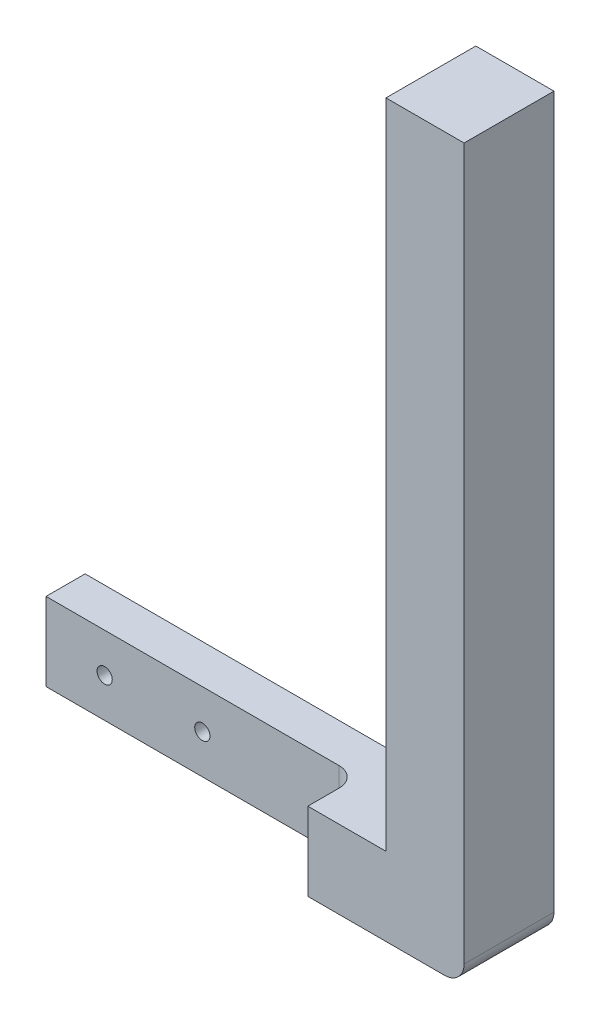
ISO-10303-21;
HEADER;
FILE_DESCRIPTION(('STEP AP214'),'2;1');
FILE_NAME('part.step','',(''),(''),'','','');
FILE_SCHEMA(('AUTOMOTIVE_DESIGN { 1 0 10303 214 1 1 1 1 }'));
ENDSEC;
DATA;
#1=APPLICATION_CONTEXT('core data for automotive mechanical design processes');
#2=APPLICATION_PROTOCOL_DEFINITION('international standard','automotive_design',2000,#1);
#3=PRODUCT_CONTEXT('',#1,'mechanical');
#4=PRODUCT('Part','Part','',(#3));
#5=PRODUCT_RELATED_PRODUCT_CATEGORY('part','',(#4));
#6=PRODUCT_DEFINITION_FORMATION('','',#4);
#7=PRODUCT_DEFINITION_CONTEXT('part definition',#1,'design');
#8=PRODUCT_DEFINITION('design','',#6,#7);
#9=PRODUCT_DEFINITION_SHAPE('','',#8);
#10=(LENGTH_UNIT() NAMED_UNIT(*) SI_UNIT(.MILLI.,.METRE.));
#11=(NAMED_UNIT(*) PLANE_ANGLE_UNIT() SI_UNIT($,.RADIAN.));
#12=(NAMED_UNIT(*) SI_UNIT($,.STERADIAN.) SOLID_ANGLE_UNIT());
#13=UNCERTAINTY_MEASURE_WITH_UNIT(LENGTH_MEASURE(1.E-05),#10,'distance_accuracy_value','');
#14=(GEOMETRIC_REPRESENTATION_CONTEXT(3) GLOBAL_UNCERTAINTY_ASSIGNED_CONTEXT((#13)) GLOBAL_UNIT_ASSIGNED_CONTEXT((#10,
#11,#12)) REPRESENTATION_CONTEXT('',''));
#15=CARTESIAN_POINT('',(0.,0.,0.));
#16=DIRECTION('',(0.,0.,1.));
#17=DIRECTION('',(1.,0.,0.));
#18=AXIS2_PLACEMENT_3D('',#15,#16,#17);
#19=CARTESIAN_POINT('',(0.,0.,10.));
#20=DIRECTION('',(0.,0.,-1.));
#21=DIRECTION('',(-1.,0.,0.));
#22=AXIS2_PLACEMENT_3D('',#19,#20,#21);
#23=PLANE('',#22);
#24=CARTESIAN_POINT('',(40.,10.,10.));
#25=DIRECTION('',(0.,0.,1.));
#26=DIRECTION('',(1.,0.,0.));
#27=AXIS2_PLACEMENT_3D('',#24,#25,#26);
#28=CIRCLE('',#27,1.95);
#29=CARTESIAN_POINT('',(41.95,10.,10.));
#30=VERTEX_POINT('',#29);
#31=EDGE_CURVE('E187',#30,#30,#28,.T.);
#32=ORIENTED_EDGE('',*,*,#31,.F.);
#33=EDGE_LOOP('',(#32));
#34=FACE_BOUND('',#33,.T.);
#35=CARTESIAN_POINT('',(15.,10.,10.));
#36=DIRECTION('',(0.,0.,1.));
#37=DIRECTION('',(1.,0.,0.));
#38=AXIS2_PLACEMENT_3D('',#35,#36,#37);
#39=CIRCLE('',#38,1.95);
#40=CARTESIAN_POINT('',(16.95,10.,10.));
#41=VERTEX_POINT('',#40);
#42=EDGE_CURVE('E195',#41,#41,#39,.T.);
#43=ORIENTED_EDGE('',*,*,#42,.F.);
#44=EDGE_LOOP('',(#43));
#45=FACE_BOUND('',#44,.T.);
#46=DIRECTION('',(1.,0.,0.));
#47=VECTOR('',#46,1.);
#48=CARTESIAN_POINT('',(0.,0.,10.));
#49=LINE('',#48,#47);
#50=CARTESIAN_POINT('',(0.,0.,10.));
#51=VERTEX_POINT('',#50);
#52=CARTESIAN_POINT('',(75.,0.,10.));
#53=VERTEX_POINT('',#52);
#54=EDGE_CURVE('E207',#51,#53,#49,.T.);
#55=ORIENTED_EDGE('',*,*,#54,.T.);
#56=DIRECTION('',(0.,-1.,0.));
#57=VECTOR('',#56,1.);
#58=CARTESIAN_POINT('',(75.,20.,10.));
#59=LINE('',#58,#57);
#60=CARTESIAN_POINT('',(75.,20.,10.));
#61=VERTEX_POINT('',#60);
#62=EDGE_CURVE('E238',#53,#61,#59,.F.);
#63=ORIENTED_EDGE('',*,*,#62,.T.);
#64=DIRECTION('',(-1.,0.,0.));
#65=VECTOR('',#64,1.);
#66=CARTESIAN_POINT('',(0.,20.,10.));
#67=LINE('',#66,#65);
#68=CARTESIAN_POINT('',(0.,20.,10.));
#69=VERTEX_POINT('',#68);
#70=EDGE_CURVE('E211',#61,#69,#67,.T.);
#71=ORIENTED_EDGE('',*,*,#70,.T.);
#72=DIRECTION('',(0.,-1.,0.));
#73=VECTOR('',#72,1.);
#74=CARTESIAN_POINT('',(0.,0.,10.));
#75=LINE('',#74,#73);
#76=EDGE_CURVE('E203',#69,#51,#75,.T.);
#77=ORIENTED_EDGE('',*,*,#76,.T.);
#78=EDGE_LOOP('',(#55,#63,#71,#77));
#79=FACE_BOUND('',#78,.T.);
#80=ADVANCED_FACE('F42',(#34,#45,#79),#23,.F.);
#81=CARTESIAN_POINT('',(0.,0.,0.));
#82=DIRECTION('',(0.,0.,-1.));
#83=DIRECTION('',(-1.,0.,0.));
#84=AXIS2_PLACEMENT_3D('',#81,#82,#83);
#85=PLANE('',#84);
#86=CARTESIAN_POINT('',(110.,177.,0.));
#87=DIRECTION('',(0.,0.,1.));
#88=DIRECTION('',(1.,0.,0.));
#89=AXIS2_PLACEMENT_3D('',#86,#87,#88);
#90=CIRCLE('',#89,1.925);
#91=CARTESIAN_POINT('',(111.925,177.,0.));
#92=VERTEX_POINT('',#91);
#93=EDGE_CURVE('E151',#92,#92,#90,.T.);
#94=ORIENTED_EDGE('',*,*,#93,.T.);
#95=EDGE_LOOP('',(#94));
#96=FACE_BOUND('',#95,.T.);
#97=CARTESIAN_POINT('',(110.,162.,0.));
#98=DIRECTION('',(0.,0.,1.));
#99=DIRECTION('',(1.,0.,0.));
#100=AXIS2_PLACEMENT_3D('',#97,#98,#99);
#101=CIRCLE('',#100,1.925);
#102=CARTESIAN_POINT('',(111.925,162.,0.));
#103=VERTEX_POINT('',#102);
#104=EDGE_CURVE('E154',#103,#103,#101,.T.);
#105=ORIENTED_EDGE('',*,*,#104,.T.);
#106=EDGE_LOOP('',(#105));
#107=FACE_BOUND('',#106,.T.);
#108=CARTESIAN_POINT('',(15.,10.,0.));
#109=DIRECTION('',(0.,0.,1.));
#110=DIRECTION('',(1.,0.,0.));
#111=AXIS2_PLACEMENT_3D('',#108,#109,#110);
#112=CIRCLE('',#111,1.95);
#113=CARTESIAN_POINT('',(16.95,10.,0.));
#114=VERTEX_POINT('',#113);
#115=EDGE_CURVE('E191',#114,#114,#112,.T.);
#116=ORIENTED_EDGE('',*,*,#115,.T.);
#117=EDGE_LOOP('',(#116));
#118=FACE_BOUND('',#117,.T.);
#119=DIRECTION('',(0.,-1.,0.));
#120=VECTOR('',#119,1.);
#121=CARTESIAN_POINT('',(120.,187.,0.));
#122=LINE('',#121,#120);
#123=CARTESIAN_POINT('',(120.,187.,0.));
#124=VERTEX_POINT('',#123);
#125=CARTESIAN_POINT('',(120.,5.,0.));
#126=VERTEX_POINT('',#125);
#127=EDGE_CURVE('E129',#124,#126,#122,.T.);
#128=ORIENTED_EDGE('',*,*,#127,.T.);
#129=CARTESIAN_POINT('',(115.,5.,0.));
#130=DIRECTION('',(0.,0.,-1.));
#131=DIRECTION('',(-1.,0.,0.));
#132=AXIS2_PLACEMENT_3D('',#129,#130,#131);
#133=CIRCLE('',#132,5.);
#134=CARTESIAN_POINT('',(115.,0.,0.));
#135=VERTEX_POINT('',#134);
#136=EDGE_CURVE('E12',#126,#135,#133,.T.);
#137=ORIENTED_EDGE('',*,*,#136,.T.);
#138=DIRECTION('',(1.,0.,0.));
#139=VECTOR('',#138,1.);
#140=CARTESIAN_POINT('',(0.,0.,0.));
#141=LINE('',#140,#139);
#142=CARTESIAN_POINT('',(0.,0.,0.));
#143=VERTEX_POINT('',#142);
#144=EDGE_CURVE('E218',#143,#135,#141,.T.);
#145=ORIENTED_EDGE('',*,*,#144,.F.);
#146=DIRECTION('',(0.,-1.,0.));
#147=VECTOR('',#146,1.);
#148=CARTESIAN_POINT('',(0.,0.,0.));
#149=LINE('',#148,#147);
#150=CARTESIAN_POINT('',(0.,20.,0.));
#151=VERTEX_POINT('',#150);
#152=EDGE_CURVE('E199',#151,#143,#149,.T.);
#153=ORIENTED_EDGE('',*,*,#152,.F.);
#154=DIRECTION('',(-1.,0.,0.));
#155=VECTOR('',#154,1.);
#156=CARTESIAN_POINT('',(0.,20.,0.));
#157=LINE('',#156,#155);
#158=CARTESIAN_POINT('',(100.,20.,0.));
#159=VERTEX_POINT('',#158);
#160=EDGE_CURVE('E124',#159,#151,#157,.T.);
#161=ORIENTED_EDGE('',*,*,#160,.F.);
#162=DIRECTION('',(0.,-1.,0.));
#163=VECTOR('',#162,1.);
#164=CARTESIAN_POINT('',(100.,187.,0.));
#165=LINE('',#164,#163);
#166=CARTESIAN_POINT('',(100.,187.,0.));
#167=VERTEX_POINT('',#166);
#168=EDGE_CURVE('E118',#167,#159,#165,.T.);
#169=ORIENTED_EDGE('',*,*,#168,.F.);
#170=DIRECTION('',(1.,0.,0.));
#171=VECTOR('',#170,1.);
#172=CARTESIAN_POINT('',(100.,187.,0.));
#173=LINE('',#172,#171);
#174=EDGE_CURVE('E122',#167,#124,#173,.T.);
#175=ORIENTED_EDGE('',*,*,#174,.T.);
#176=EDGE_LOOP('',(#128,#137,#145,#153,#161,#169,#175));
#177=FACE_BOUND('',#176,.T.);
#178=CARTESIAN_POINT('',(40.,10.,0.));
#179=DIRECTION('',(0.,0.,1.));
#180=DIRECTION('',(1.,0.,0.));
#181=AXIS2_PLACEMENT_3D('',#178,#179,#180);
#182=CIRCLE('',#181,1.95);
#183=CARTESIAN_POINT('',(41.95,10.,0.));
#184=VERTEX_POINT('',#183);
#185=EDGE_CURVE('E186',#184,#184,#182,.T.);
#186=ORIENTED_EDGE('',*,*,#185,.T.);
#187=EDGE_LOOP('',(#186));
#188=FACE_BOUND('',#187,.T.);
#189=ADVANCED_FACE('F120',(#96,#107,#118,#177,#188),#85,.T.);
#190=CARTESIAN_POINT('',(0.,0.,10.));
#191=DIRECTION('',(1.,0.,0.));
#192=DIRECTION('',(0.,0.,-1.));
#193=AXIS2_PLACEMENT_3D('',#190,#191,#192);
#194=PLANE('',#193);
#195=ORIENTED_EDGE('',*,*,#152,.T.);
#196=DIRECTION('',(0.,0.,-1.));
#197=VECTOR('',#196,1.);
#198=CARTESIAN_POINT('',(0.,0.,10.));
#199=LINE('',#198,#197);
#200=EDGE_CURVE('E230',#51,#143,#199,.T.);
#201=ORIENTED_EDGE('',*,*,#200,.F.);
#202=ORIENTED_EDGE('',*,*,#76,.F.);
#203=DIRECTION('',(0.,0.,-1.));
#204=VECTOR('',#203,1.);
#205=CARTESIAN_POINT('',(0.,20.,10.));
#206=LINE('',#205,#204);
#207=EDGE_CURVE('E214',#69,#151,#206,.T.);
#208=ORIENTED_EDGE('',*,*,#207,.T.);
#209=EDGE_LOOP('',(#195,#201,#202,#208));
#210=FACE_BOUND('',#209,.T.);
#211=ADVANCED_FACE('F278',(#210),#194,.F.);
#212=CARTESIAN_POINT('',(0.,0.,10.));
#213=DIRECTION('',(0.,1.,0.));
#214=DIRECTION('',(0.,0.,1.));
#215=AXIS2_PLACEMENT_3D('',#212,#213,#214);
#216=PLANE('',#215);
#217=ORIENTED_EDGE('',*,*,#144,.T.);
#218=DIRECTION('',(0.,0.,1.));
#219=VECTOR('',#218,1.);
#220=CARTESIAN_POINT('',(115.,0.,23.));
#221=LINE('',#220,#219);
#222=CARTESIAN_POINT('',(115.,0.,23.));
#223=VERTEX_POINT('',#222);
#224=EDGE_CURVE('E247',#135,#223,#221,.T.);
#225=ORIENTED_EDGE('',*,*,#224,.T.);
#226=DIRECTION('',(1.,0.,0.));
#227=VECTOR('',#226,1.);
#228=CARTESIAN_POINT('',(80.,0.,23.));
#229=LINE('',#228,#227);
#230=CARTESIAN_POINT('',(80.,0.,23.));
#231=VERTEX_POINT('',#230);
#232=EDGE_CURVE('E172',#231,#223,#229,.T.);
#233=ORIENTED_EDGE('',*,*,#232,.F.);
#234=DIRECTION('',(0.,0.,-1.));
#235=VECTOR('',#234,1.);
#236=CARTESIAN_POINT('',(80.,0.,23.));
#237=LINE('',#236,#235);
#238=CARTESIAN_POINT('',(80.,0.,15.));
#239=VERTEX_POINT('',#238);
#240=EDGE_CURVE('E182',#231,#239,#237,.T.);
#241=ORIENTED_EDGE('',*,*,#240,.T.);
#242=CARTESIAN_POINT('',(75.,0.,15.));
#243=DIRECTION('',(0.,1.,0.));
#244=DIRECTION('',(0.,0.,1.));
#245=AXIS2_PLACEMENT_3D('',#242,#243,#244);
#246=CIRCLE('',#245,5.);
#247=EDGE_CURVE('E241',#239,#53,#246,.T.);
#248=ORIENTED_EDGE('',*,*,#247,.T.);
#249=ORIENTED_EDGE('',*,*,#54,.F.);
#250=ORIENTED_EDGE('',*,*,#200,.T.);
#251=EDGE_LOOP('',(#217,#225,#233,#241,#248,#249,#250));
#252=FACE_BOUND('',#251,.T.);
#253=ADVANCED_FACE('F255',(#252),#216,.F.);
#254=CARTESIAN_POINT('',(0.,20.,10.));
#255=DIRECTION('',(0.,-1.,0.));
#256=DIRECTION('',(0.,0.,-1.));
#257=AXIS2_PLACEMENT_3D('',#254,#255,#256);
#258=PLANE('',#257);
#259=ORIENTED_EDGE('',*,*,#160,.T.);
#260=ORIENTED_EDGE('',*,*,#207,.F.);
#261=ORIENTED_EDGE('',*,*,#70,.F.);
#262=CARTESIAN_POINT('',(75.,20.,15.));
#263=DIRECTION('',(0.,-1.,0.));
#264=DIRECTION('',(0.,0.,-1.));
#265=AXIS2_PLACEMENT_3D('',#262,#263,#264);
#266=CIRCLE('',#265,5.);
#267=CARTESIAN_POINT('',(80.,20.,15.));
#268=VERTEX_POINT('',#267);
#269=EDGE_CURVE('E244',#61,#268,#266,.T.);
#270=ORIENTED_EDGE('',*,*,#269,.T.);
#271=DIRECTION('',(0.,0.,-1.));
#272=VECTOR('',#271,1.);
#273=CARTESIAN_POINT('',(80.,20.,23.));
#274=LINE('',#273,#272);
#275=CARTESIAN_POINT('',(80.,20.,23.));
#276=VERTEX_POINT('',#275);
#277=EDGE_CURVE('E178',#276,#268,#274,.T.);
#278=ORIENTED_EDGE('',*,*,#277,.F.);
#279=DIRECTION('',(-1.,0.,0.));
#280=VECTOR('',#279,1.);
#281=CARTESIAN_POINT('',(80.,20.,23.));
#282=LINE('',#281,#280);
#283=CARTESIAN_POINT('',(100.,20.,23.));
#284=VERTEX_POINT('',#283);
#285=EDGE_CURVE('E175',#284,#276,#282,.T.);
#286=ORIENTED_EDGE('',*,*,#285,.F.);
#287=DIRECTION('',(0.,0.,-1.));
#288=VECTOR('',#287,1.);
#289=CARTESIAN_POINT('',(100.,20.,10.));
#290=LINE('',#289,#288);
#291=EDGE_CURVE('E227',#284,#159,#290,.T.);
#292=ORIENTED_EDGE('',*,*,#291,.T.);
#293=EDGE_LOOP('',(#259,#260,#261,#270,#278,#286,#292));
#294=FACE_BOUND('',#293,.T.);
#295=ADVANCED_FACE('F275',(#294),#258,.F.);
#296=CARTESIAN_POINT('',(15.,10.,10.));
#297=DIRECTION('',(0.,0.,-1.));
#298=DIRECTION('',(-1.,0.,0.));
#299=AXIS2_PLACEMENT_3D('',#296,#297,#298);
#300=CYLINDRICAL_SURFACE('',#299,1.95);
#301=ORIENTED_EDGE('',*,*,#42,.T.);
#302=EDGE_LOOP('',(#301));
#303=FACE_BOUND('',#302,.T.);
#304=ORIENTED_EDGE('',*,*,#115,.F.);
#305=EDGE_LOOP('',(#304));
#306=FACE_BOUND('',#305,.T.);
#307=ADVANCED_FACE('F299',(#303,#306),#300,.F.);
#308=CARTESIAN_POINT('',(40.,10.,10.));
#309=DIRECTION('',(0.,0.,-1.));
#310=DIRECTION('',(-1.,0.,0.));
#311=AXIS2_PLACEMENT_3D('',#308,#309,#310);
#312=CYLINDRICAL_SURFACE('',#311,1.95);
#313=ORIENTED_EDGE('',*,*,#31,.T.);
#314=EDGE_LOOP('',(#313));
#315=FACE_BOUND('',#314,.T.);
#316=ORIENTED_EDGE('',*,*,#185,.F.);
#317=EDGE_LOOP('',(#316));
#318=FACE_BOUND('',#317,.T.);
#319=ADVANCED_FACE('F328',(#315,#318),#312,.F.);
#320=CARTESIAN_POINT('',(80.,0.,23.));
#321=DIRECTION('',(1.,0.,0.));
#322=DIRECTION('',(0.,0.,-1.));
#323=AXIS2_PLACEMENT_3D('',#320,#321,#322);
#324=PLANE('',#323);
#325=ORIENTED_EDGE('',*,*,#277,.T.);
#326=DIRECTION('',(0.,-1.,0.));
#327=VECTOR('',#326,1.);
#328=CARTESIAN_POINT('',(80.,0.,15.));
#329=LINE('',#328,#327);
#330=EDGE_CURVE('E234',#268,#239,#329,.T.);
#331=ORIENTED_EDGE('',*,*,#330,.T.);
#332=ORIENTED_EDGE('',*,*,#240,.F.);
#333=DIRECTION('',(0.,-1.,0.));
#334=VECTOR('',#333,1.);
#335=CARTESIAN_POINT('',(80.,0.,23.));
#336=LINE('',#335,#334);
#337=EDGE_CURVE('E163',#276,#231,#336,.T.);
#338=ORIENTED_EDGE('',*,*,#337,.F.);
#339=EDGE_LOOP('',(#325,#331,#332,#338));
#340=FACE_BOUND('',#339,.T.);
#341=ADVANCED_FACE('F264',(#340),#324,.F.);
#342=CARTESIAN_POINT('',(0.,0.,23.));
#343=DIRECTION('',(0.,0.,-1.));
#344=DIRECTION('',(-1.,0.,0.));
#345=AXIS2_PLACEMENT_3D('',#342,#343,#344);
#346=PLANE('',#345);
#347=ORIENTED_EDGE('',*,*,#232,.T.);
#348=CARTESIAN_POINT('',(115.,5.,23.));
#349=DIRECTION('',(0.,0.,-1.));
#350=DIRECTION('',(-1.,0.,0.));
#351=AXIS2_PLACEMENT_3D('',#348,#349,#350);
#352=CIRCLE('',#351,5.);
#353=CARTESIAN_POINT('',(120.,5.,23.));
#354=VERTEX_POINT('',#353);
#355=EDGE_CURVE('E65',#223,#354,#352,.F.);
#356=ORIENTED_EDGE('',*,*,#355,.T.);
#357=DIRECTION('',(0.,-1.,0.));
#358=VECTOR('',#357,1.);
#359=CARTESIAN_POINT('',(120.,187.,23.));
#360=LINE('',#359,#358);
#361=CARTESIAN_POINT('',(120.,187.,23.));
#362=VERTEX_POINT('',#361);
#363=EDGE_CURVE('E164',#362,#354,#360,.T.);
#364=ORIENTED_EDGE('',*,*,#363,.F.);
#365=DIRECTION('',(-1.,0.,0.));
#366=VECTOR('',#365,1.);
#367=CARTESIAN_POINT('',(100.,187.,23.));
#368=LINE('',#367,#366);
#369=CARTESIAN_POINT('',(100.,187.,23.));
#370=VERTEX_POINT('',#369);
#371=EDGE_CURVE('E130',#362,#370,#368,.T.);
#372=ORIENTED_EDGE('',*,*,#371,.T.);
#373=DIRECTION('',(0.,-1.,0.));
#374=VECTOR('',#373,1.);
#375=CARTESIAN_POINT('',(100.,187.,23.));
#376=LINE('',#375,#374);
#377=EDGE_CURVE('E145',#370,#284,#376,.T.);
#378=ORIENTED_EDGE('',*,*,#377,.T.);
#379=ORIENTED_EDGE('',*,*,#285,.T.);
#380=ORIENTED_EDGE('',*,*,#337,.T.);
#381=EDGE_LOOP('',(#347,#356,#364,#372,#378,#379,#380));
#382=FACE_BOUND('',#381,.T.);
#383=ADVANCED_FACE('F258',(#382),#346,.F.);
#384=CARTESIAN_POINT('',(100.,187.,23.));
#385=DIRECTION('',(-1.,0.,0.));
#386=DIRECTION('',(0.,0.,1.));
#387=AXIS2_PLACEMENT_3D('',#384,#385,#386);
#388=PLANE('',#387);
#389=ORIENTED_EDGE('',*,*,#291,.F.);
#390=ORIENTED_EDGE('',*,*,#377,.F.);
#391=DIRECTION('',(0.,0.,-1.));
#392=VECTOR('',#391,1.);
#393=CARTESIAN_POINT('',(100.,187.,23.));
#394=LINE('',#393,#392);
#395=EDGE_CURVE('E137',#370,#167,#394,.T.);
#396=ORIENTED_EDGE('',*,*,#395,.T.);
#397=ORIENTED_EDGE('',*,*,#168,.T.);
#398=EDGE_LOOP('',(#389,#390,#396,#397));
#399=FACE_BOUND('',#398,.T.);
#400=ADVANCED_FACE('F143',(#399),#388,.T.);
#401=CARTESIAN_POINT('',(120.,187.,23.));
#402=DIRECTION('',(1.,0.,0.));
#403=DIRECTION('',(0.,0.,-1.));
#404=AXIS2_PLACEMENT_3D('',#401,#402,#403);
#405=PLANE('',#404);
#406=ORIENTED_EDGE('',*,*,#363,.T.);
#407=DIRECTION('',(0.,0.,1.));
#408=VECTOR('',#407,1.);
#409=CARTESIAN_POINT('',(120.,5.,0.));
#410=LINE('',#409,#408);
#411=EDGE_CURVE('E51',#354,#126,#410,.F.);
#412=ORIENTED_EDGE('',*,*,#411,.T.);
#413=ORIENTED_EDGE('',*,*,#127,.F.);
#414=DIRECTION('',(0.,0.,1.));
#415=VECTOR('',#414,1.);
#416=CARTESIAN_POINT('',(120.,187.,23.));
#417=LINE('',#416,#415);
#418=EDGE_CURVE('E140',#124,#362,#417,.T.);
#419=ORIENTED_EDGE('',*,*,#418,.T.);
#420=EDGE_LOOP('',(#406,#412,#413,#419));
#421=FACE_BOUND('',#420,.T.);
#422=ADVANCED_FACE('F352',(#421),#405,.T.);
#423=CARTESIAN_POINT('',(0.,187.,0.));
#424=DIRECTION('',(0.,-1.,0.));
#425=DIRECTION('',(0.,0.,-1.));
#426=AXIS2_PLACEMENT_3D('',#423,#424,#425);
#427=PLANE('',#426);
#428=ORIENTED_EDGE('',*,*,#395,.F.);
#429=ORIENTED_EDGE('',*,*,#371,.F.);
#430=ORIENTED_EDGE('',*,*,#418,.F.);
#431=ORIENTED_EDGE('',*,*,#174,.F.);
#432=EDGE_LOOP('',(#428,#429,#430,#431));
#433=FACE_BOUND('',#432,.T.);
#434=ADVANCED_FACE('F135',(#433),#427,.F.);
#435=CARTESIAN_POINT('',(75.,0.,15.));
#436=DIRECTION('',(0.,1.,0.));
#437=DIRECTION('',(0.,0.,1.));
#438=AXIS2_PLACEMENT_3D('',#435,#436,#437);
#439=CYLINDRICAL_SURFACE('',#438,5.);
#440=ORIENTED_EDGE('',*,*,#269,.F.);
#441=ORIENTED_EDGE('',*,*,#62,.F.);
#442=ORIENTED_EDGE('',*,*,#247,.F.);
#443=ORIENTED_EDGE('',*,*,#330,.F.);
#444=EDGE_LOOP('',(#440,#441,#442,#443));
#445=FACE_BOUND('',#444,.T.);
#446=ADVANCED_FACE('F273',(#445),#439,.F.);
#447=CARTESIAN_POINT('',(115.,5.,10.));
#448=DIRECTION('',(0.,0.,-1.));
#449=DIRECTION('',(-1.,0.,0.));
#450=AXIS2_PLACEMENT_3D('',#447,#448,#449);
#451=CYLINDRICAL_SURFACE('',#450,5.);
#452=ORIENTED_EDGE('',*,*,#136,.F.);
#453=ORIENTED_EDGE('',*,*,#411,.F.);
#454=ORIENTED_EDGE('',*,*,#355,.F.);
#455=ORIENTED_EDGE('',*,*,#224,.F.);
#456=EDGE_LOOP('',(#452,#453,#454,#455));
#457=FACE_BOUND('',#456,.T.);
#458=ADVANCED_FACE('F44',(#457),#451,.T.);
#459=CARTESIAN_POINT('',(110.,162.,5.));
#460=DIRECTION('',(0.,0.,-1.));
#461=DIRECTION('',(-1.,0.,0.));
#462=AXIS2_PLACEMENT_3D('',#459,#460,#461);
#463=CYLINDRICAL_SURFACE('',#462,1.925);
#464=CARTESIAN_POINT('',(110.,162.,5.));
#465=DIRECTION('',(0.,0.,1.));
#466=DIRECTION('',(1.,0.,0.));
#467=AXIS2_PLACEMENT_3D('',#464,#465,#466);
#468=CIRCLE('',#467,1.925);
#469=CARTESIAN_POINT('',(111.925,162.,5.));
#470=VERTEX_POINT('',#469);
#471=EDGE_CURVE('E417',#470,#470,#468,.T.);
#472=ORIENTED_EDGE('',*,*,#471,.T.);
#473=EDGE_LOOP('',(#472));
#474=FACE_BOUND('',#473,.T.);
#475=ORIENTED_EDGE('',*,*,#104,.F.);
#476=EDGE_LOOP('',(#475));
#477=FACE_BOUND('',#476,.T.);
#478=ADVANCED_FACE('F280',(#474,#477),#463,.F.);
#479=CARTESIAN_POINT('',(110.,162.,5.));
#480=DIRECTION('',(0.,0.,1.));
#481=DIRECTION('',(1.,0.,0.));
#482=AXIS2_PLACEMENT_3D('',#479,#480,#481);
#483=PLANE('',#482);
#484=ORIENTED_EDGE('',*,*,#471,.F.);
#485=EDGE_LOOP('',(#484));
#486=FACE_BOUND('',#485,.T.);
#487=ADVANCED_FACE('F285',(#486),#483,.F.);
#488=CARTESIAN_POINT('',(110.,177.,5.));
#489=DIRECTION('',(0.,0.,-1.));
#490=DIRECTION('',(-1.,0.,0.));
#491=AXIS2_PLACEMENT_3D('',#488,#489,#490);
#492=CYLINDRICAL_SURFACE('',#491,1.925);
#493=CARTESIAN_POINT('',(110.,177.,5.));
#494=DIRECTION('',(0.,0.,1.));
#495=DIRECTION('',(1.,0.,0.));
#496=AXIS2_PLACEMENT_3D('',#493,#494,#495);
#497=CIRCLE('',#496,1.925);
#498=CARTESIAN_POINT('',(111.925,177.,5.));
#499=VERTEX_POINT('',#498);
#500=EDGE_CURVE('E147',#499,#499,#497,.T.);
#501=ORIENTED_EDGE('',*,*,#500,.T.);
#502=EDGE_LOOP('',(#501));
#503=FACE_BOUND('',#502,.T.);
#504=ORIENTED_EDGE('',*,*,#93,.F.);
#505=EDGE_LOOP('',(#504));
#506=FACE_BOUND('',#505,.T.);
#507=ADVANCED_FACE('F388',(#503,#506),#492,.F.);
#508=CARTESIAN_POINT('',(110.,177.,5.));
#509=DIRECTION('',(0.,0.,1.));
#510=DIRECTION('',(1.,0.,0.));
#511=AXIS2_PLACEMENT_3D('',#508,#509,#510);
#512=PLANE('',#511);
#513=ORIENTED_EDGE('',*,*,#500,.F.);
#514=EDGE_LOOP('',(#513));
#515=FACE_BOUND('',#514,.T.);
#516=ADVANCED_FACE('F397',(#515),#512,.F.);
#517=CLOSED_SHELL('',(#80,#189,#211,#253,#295,#307,#319,#341,#383,#400,#422,#434,#446,#458,#478,
#487,#507,#516));
#518=MANIFOLD_SOLID_BREP('B2',#517);
#519=ADVANCED_BREP_SHAPE_REPRESENTATION('',(#18,#518),#14);
#520=SHAPE_DEFINITION_REPRESENTATION(#9,#519);
ENDSEC;
END-ISO-10303-21;
